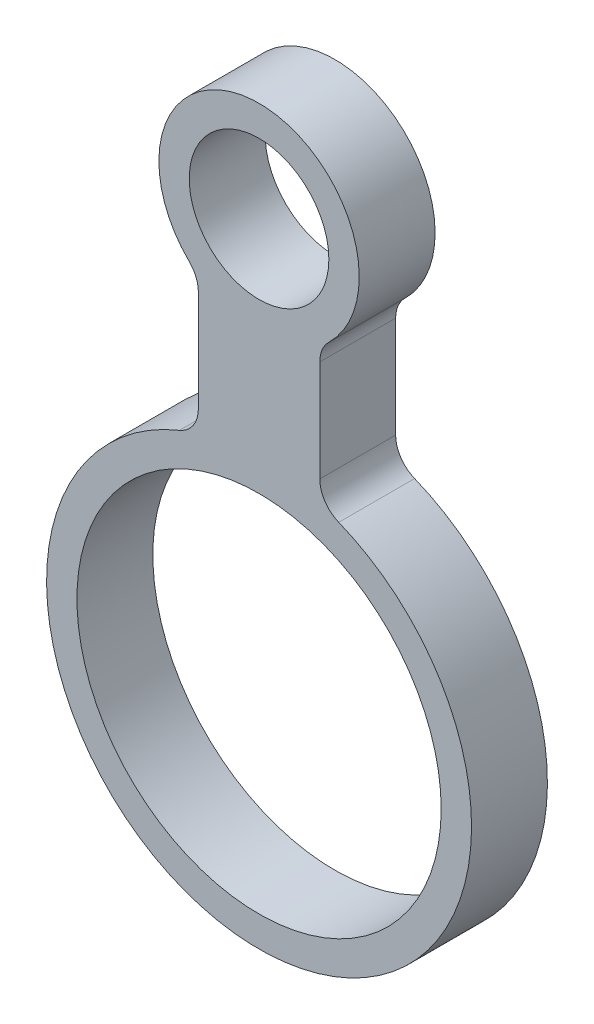
ISO-10303-21;
HEADER;
FILE_DESCRIPTION(('STEP AP214'),'2;1');
FILE_NAME('part.step','',(''),(''),'','','');
FILE_SCHEMA(('AUTOMOTIVE_DESIGN { 1 0 10303 214 1 1 1 1 }'));
ENDSEC;
DATA;
#1=APPLICATION_CONTEXT('core data for automotive mechanical design processes');
#2=APPLICATION_PROTOCOL_DEFINITION('international standard','automotive_design',2000,#1);
#3=PRODUCT_CONTEXT('',#1,'mechanical');
#4=PRODUCT('Part','Part','',(#3));
#5=PRODUCT_RELATED_PRODUCT_CATEGORY('part','',(#4));
#6=PRODUCT_DEFINITION_FORMATION('','',#4);
#7=PRODUCT_DEFINITION_CONTEXT('part definition',#1,'design');
#8=PRODUCT_DEFINITION('design','',#6,#7);
#9=PRODUCT_DEFINITION_SHAPE('','',#8);
#10=(LENGTH_UNIT() NAMED_UNIT(*) SI_UNIT(.MILLI.,.METRE.));
#11=(NAMED_UNIT(*) PLANE_ANGLE_UNIT() SI_UNIT($,.RADIAN.));
#12=(NAMED_UNIT(*) SI_UNIT($,.STERADIAN.) SOLID_ANGLE_UNIT());
#13=UNCERTAINTY_MEASURE_WITH_UNIT(LENGTH_MEASURE(1.E-05),#10,'distance_accuracy_value','');
#14=(GEOMETRIC_REPRESENTATION_CONTEXT(3) GLOBAL_UNCERTAINTY_ASSIGNED_CONTEXT((#13)) GLOBAL_UNIT_ASSIGNED_CONTEXT((#10,
#11,#12)) REPRESENTATION_CONTEXT('',''));
#15=CARTESIAN_POINT('',(0.,0.,0.));
#16=DIRECTION('',(0.,0.,1.));
#17=DIRECTION('',(1.,0.,0.));
#18=AXIS2_PLACEMENT_3D('',#15,#16,#17);
#19=CARTESIAN_POINT('',(0.,27.6661697643614,5.));
#20=DIRECTION('',(0.,0.,1.));
#21=DIRECTION('',(1.,0.,0.));
#22=AXIS2_PLACEMENT_3D('',#19,#20,#21);
#23=PLANE('',#22);
#24=CARTESIAN_POINT('',(0.,0.,5.));
#25=DIRECTION('',(0.,0.,1.));
#26=DIRECTION('',(1.,0.,0.));
#27=AXIS2_PLACEMENT_3D('',#24,#25,#26);
#28=CIRCLE('',#27,12.);
#29=CARTESIAN_POINT('',(12.,0.,5.));
#30=VERTEX_POINT('',#29);
#31=EDGE_CURVE('E200',#30,#30,#28,.T.);
#32=ORIENTED_EDGE('',*,*,#31,.F.);
#33=EDGE_LOOP('',(#32));
#34=FACE_BOUND('',#33,.T.);
#35=DIRECTION('',(0.,1.,0.));
#36=VECTOR('',#35,1.);
#37=CARTESIAN_POINT('',(4.,22.4164078649987,5.));
#38=LINE('',#37,#36);
#39=CARTESIAN_POINT('',(4.,14.8323969741913,5.));
#40=VERTEX_POINT('',#39);
#41=CARTESIAN_POINT('',(4.,21.5050010440617,5.));
#42=VERTEX_POINT('',#41);
#43=EDGE_CURVE('E152',#40,#42,#38,.T.);
#44=ORIENTED_EDGE('',*,*,#43,.T.);
#45=CARTESIAN_POINT('',(6.,21.5050010440617,5.));
#46=DIRECTION('',(0.,0.,1.));
#47=DIRECTION('',(1.,0.,0.));
#48=AXIS2_PLACEMENT_3D('',#45,#46,#47);
#49=CIRCLE('',#48,2.);
#50=CARTESIAN_POINT('',(4.6046511627907,22.9378309790151,5.));
#51=VERTEX_POINT('',#50);
#52=EDGE_CURVE('E183',#42,#51,#49,.F.);
#53=ORIENTED_EDGE('',*,*,#52,.T.);
#54=CARTESIAN_POINT('',(0.,27.6661697643614,5.));
#55=DIRECTION('',(0.,0.,1.));
#56=DIRECTION('',(1.,0.,0.));
#57=AXIS2_PLACEMENT_3D('',#54,#55,#56);
#58=CIRCLE('',#57,6.6);
#59=CARTESIAN_POINT('',(-4.6046511627907,22.9378309790151,5.));
#60=VERTEX_POINT('',#59);
#61=EDGE_CURVE('E144',#51,#60,#58,.T.);
#62=ORIENTED_EDGE('',*,*,#61,.T.);
#63=CARTESIAN_POINT('',(-6.,21.5050010440617,5.));
#64=DIRECTION('',(0.,0.,1.));
#65=DIRECTION('',(1.,0.,0.));
#66=AXIS2_PLACEMENT_3D('',#63,#64,#65);
#67=CIRCLE('',#66,2.);
#68=CARTESIAN_POINT('',(-4.,21.5050010440617,5.));
#69=VERTEX_POINT('',#68);
#70=EDGE_CURVE('E177',#60,#69,#67,.F.);
#71=ORIENTED_EDGE('',*,*,#70,.T.);
#72=DIRECTION('',(0.,-1.,0.));
#73=VECTOR('',#72,1.);
#74=CARTESIAN_POINT('',(-4.,22.4164078649987,5.));
#75=LINE('',#74,#73);
#76=CARTESIAN_POINT('',(-4.,14.8323969741913,5.));
#77=VERTEX_POINT('',#76);
#78=EDGE_CURVE('E189',#69,#77,#75,.T.);
#79=ORIENTED_EDGE('',*,*,#78,.T.);
#80=CARTESIAN_POINT('',(-6.,14.8323969741913,5.));
#81=DIRECTION('',(0.,0.,1.));
#82=DIRECTION('',(1.,0.,0.));
#83=AXIS2_PLACEMENT_3D('',#80,#81,#82);
#84=CIRCLE('',#83,2.);
#85=CARTESIAN_POINT('',(-5.25,12.9783473524174,5.));
#86=VERTEX_POINT('',#85);
#87=EDGE_CURVE('E120',#77,#86,#84,.F.);
#88=ORIENTED_EDGE('',*,*,#87,.T.);
#89=CARTESIAN_POINT('',(0.,0.,5.));
#90=DIRECTION('',(0.,0.,1.));
#91=DIRECTION('',(1.,0.,0.));
#92=AXIS2_PLACEMENT_3D('',#89,#90,#91);
#93=CIRCLE('',#92,14.);
#94=CARTESIAN_POINT('',(5.25,12.9783473524174,5.));
#95=VERTEX_POINT('',#94);
#96=EDGE_CURVE('E128',#86,#95,#93,.T.);
#97=ORIENTED_EDGE('',*,*,#96,.T.);
#98=CARTESIAN_POINT('',(6.,14.8323969741913,5.));
#99=DIRECTION('',(0.,0.,1.));
#100=DIRECTION('',(1.,0.,0.));
#101=AXIS2_PLACEMENT_3D('',#98,#99,#100);
#102=CIRCLE('',#101,2.);
#103=EDGE_CURVE('E11',#95,#40,#102,.F.);
#104=ORIENTED_EDGE('',*,*,#103,.T.);
#105=EDGE_LOOP('',(#44,#53,#62,#71,#79,#88,#97,#104));
#106=FACE_BOUND('',#105,.T.);
#107=CARTESIAN_POINT('',(0.,27.6661697643614,5.));
#108=DIRECTION('',(0.,0.,1.));
#109=DIRECTION('',(1.,0.,0.));
#110=AXIS2_PLACEMENT_3D('',#107,#108,#109);
#111=CIRCLE('',#110,4.6);
#112=CARTESIAN_POINT('',(4.6,27.6661697643614,5.));
#113=VERTEX_POINT('',#112);
#114=EDGE_CURVE('E186',#113,#113,#111,.T.);
#115=ORIENTED_EDGE('',*,*,#114,.F.);
#116=EDGE_LOOP('',(#115));
#117=FACE_BOUND('',#116,.T.);
#118=ADVANCED_FACE('F43',(#34,#106,#117),#23,.T.);
#119=CARTESIAN_POINT('',(0.,27.6661697643614,0.));
#120=DIRECTION('',(0.,0.,1.));
#121=DIRECTION('',(1.,0.,0.));
#122=AXIS2_PLACEMENT_3D('',#119,#120,#121);
#123=PLANE('',#122);
#124=CARTESIAN_POINT('',(0.,27.6661697643614,0.));
#125=DIRECTION('',(0.,0.,1.));
#126=DIRECTION('',(1.,0.,0.));
#127=AXIS2_PLACEMENT_3D('',#124,#125,#126);
#128=CIRCLE('',#127,6.6);
#129=CARTESIAN_POINT('',(4.6046511627907,22.9378309790151,0.));
#130=VERTEX_POINT('',#129);
#131=CARTESIAN_POINT('',(-4.6046511627907,22.9378309790151,0.));
#132=VERTEX_POINT('',#131);
#133=EDGE_CURVE('E147',#130,#132,#128,.T.);
#134=ORIENTED_EDGE('',*,*,#133,.F.);
#135=CARTESIAN_POINT('',(6.,21.5050010440617,0.));
#136=DIRECTION('',(0.,0.,1.));
#137=DIRECTION('',(1.,0.,0.));
#138=AXIS2_PLACEMENT_3D('',#135,#136,#137);
#139=CIRCLE('',#138,2.);
#140=CARTESIAN_POINT('',(4.,21.5050010440617,0.));
#141=VERTEX_POINT('',#140);
#142=EDGE_CURVE('E180',#130,#141,#139,.T.);
#143=ORIENTED_EDGE('',*,*,#142,.T.);
#144=DIRECTION('',(0.,1.,0.));
#145=VECTOR('',#144,1.);
#146=CARTESIAN_POINT('',(4.,22.4164078649987,0.));
#147=LINE('',#146,#145);
#148=CARTESIAN_POINT('',(4.,14.8323969741913,0.));
#149=VERTEX_POINT('',#148);
#150=EDGE_CURVE('E138',#149,#141,#147,.T.);
#151=ORIENTED_EDGE('',*,*,#150,.F.);
#152=CARTESIAN_POINT('',(6.,14.8323969741913,0.));
#153=DIRECTION('',(0.,0.,1.));
#154=DIRECTION('',(1.,0.,0.));
#155=AXIS2_PLACEMENT_3D('',#152,#153,#154);
#156=CIRCLE('',#155,2.);
#157=CARTESIAN_POINT('',(5.25,12.9783473524174,0.));
#158=VERTEX_POINT('',#157);
#159=EDGE_CURVE('E52',#149,#158,#156,.T.);
#160=ORIENTED_EDGE('',*,*,#159,.T.);
#161=CARTESIAN_POINT('',(0.,0.,0.));
#162=DIRECTION('',(0.,0.,1.));
#163=DIRECTION('',(1.,0.,0.));
#164=AXIS2_PLACEMENT_3D('',#161,#162,#163);
#165=CIRCLE('',#164,14.);
#166=CARTESIAN_POINT('',(-5.25,12.9783473524174,0.));
#167=VERTEX_POINT('',#166);
#168=EDGE_CURVE('E126',#167,#158,#165,.T.);
#169=ORIENTED_EDGE('',*,*,#168,.F.);
#170=CARTESIAN_POINT('',(-6.,14.8323969741913,0.));
#171=DIRECTION('',(0.,0.,1.));
#172=DIRECTION('',(1.,0.,0.));
#173=AXIS2_PLACEMENT_3D('',#170,#171,#172);
#174=CIRCLE('',#173,2.);
#175=CARTESIAN_POINT('',(-4.,14.8323969741913,0.));
#176=VERTEX_POINT('',#175);
#177=EDGE_CURVE('E109',#167,#176,#174,.T.);
#178=ORIENTED_EDGE('',*,*,#177,.T.);
#179=DIRECTION('',(0.,-1.,0.));
#180=VECTOR('',#179,1.);
#181=CARTESIAN_POINT('',(-4.,22.4164078649987,0.));
#182=LINE('',#181,#180);
#183=CARTESIAN_POINT('',(-4.,21.5050010440617,0.));
#184=VERTEX_POINT('',#183);
#185=EDGE_CURVE('E139',#184,#176,#182,.T.);
#186=ORIENTED_EDGE('',*,*,#185,.F.);
#187=CARTESIAN_POINT('',(-6.,21.5050010440617,0.));
#188=DIRECTION('',(0.,0.,1.));
#189=DIRECTION('',(1.,0.,0.));
#190=AXIS2_PLACEMENT_3D('',#187,#188,#189);
#191=CIRCLE('',#190,2.);
#192=EDGE_CURVE('E174',#184,#132,#191,.T.);
#193=ORIENTED_EDGE('',*,*,#192,.T.);
#194=EDGE_LOOP('',(#134,#143,#151,#160,#169,#178,#186,#193));
#195=FACE_BOUND('',#194,.T.);
#196=CARTESIAN_POINT('',(0.,0.,0.));
#197=DIRECTION('',(0.,0.,1.));
#198=DIRECTION('',(1.,0.,0.));
#199=AXIS2_PLACEMENT_3D('',#196,#197,#198);
#200=CIRCLE('',#199,12.);
#201=CARTESIAN_POINT('',(12.,0.,0.));
#202=VERTEX_POINT('',#201);
#203=EDGE_CURVE('E197',#202,#202,#200,.T.);
#204=ORIENTED_EDGE('',*,*,#203,.T.);
#205=EDGE_LOOP('',(#204));
#206=FACE_BOUND('',#205,.T.);
#207=CARTESIAN_POINT('',(0.,27.6661697643614,0.));
#208=DIRECTION('',(0.,0.,1.));
#209=DIRECTION('',(1.,0.,0.));
#210=AXIS2_PLACEMENT_3D('',#207,#208,#209);
#211=CIRCLE('',#210,4.6);
#212=CARTESIAN_POINT('',(4.6,27.6661697643614,0.));
#213=VERTEX_POINT('',#212);
#214=EDGE_CURVE('E193',#213,#213,#211,.T.);
#215=ORIENTED_EDGE('',*,*,#214,.T.);
#216=EDGE_LOOP('',(#215));
#217=FACE_BOUND('',#216,.T.);
#218=ADVANCED_FACE('F134',(#195,#206,#217),#123,.F.);
#219=CARTESIAN_POINT('',(0.,27.6661697643614,5.));
#220=DIRECTION('',(0.,0.,-1.));
#221=DIRECTION('',(-1.,0.,0.));
#222=AXIS2_PLACEMENT_3D('',#219,#220,#221);
#223=CYLINDRICAL_SURFACE('',#222,6.6);
#224=ORIENTED_EDGE('',*,*,#133,.T.);
#225=DIRECTION('',(0.,0.,-1.));
#226=VECTOR('',#225,1.);
#227=CARTESIAN_POINT('',(-4.6046511627907,22.9378309790151,5.));
#228=LINE('',#227,#226);
#229=EDGE_CURVE('E163',#132,#60,#228,.F.);
#230=ORIENTED_EDGE('',*,*,#229,.T.);
#231=ORIENTED_EDGE('',*,*,#61,.F.);
#232=DIRECTION('',(0.,0.,-1.));
#233=VECTOR('',#232,1.);
#234=CARTESIAN_POINT('',(4.6046511627907,22.9378309790151,5.));
#235=LINE('',#234,#233);
#236=EDGE_CURVE('E159',#51,#130,#235,.T.);
#237=ORIENTED_EDGE('',*,*,#236,.T.);
#238=EDGE_LOOP('',(#224,#230,#231,#237));
#239=FACE_BOUND('',#238,.T.);
#240=ADVANCED_FACE('F229',(#239),#223,.T.);
#241=CARTESIAN_POINT('',(-4.,22.4164078649987,5.));
#242=DIRECTION('',(1.,0.,0.));
#243=DIRECTION('',(0.,1.,0.));
#244=AXIS2_PLACEMENT_3D('',#241,#242,#243);
#245=PLANE('',#244);
#246=ORIENTED_EDGE('',*,*,#185,.T.);
#247=DIRECTION('',(0.,0.,1.));
#248=VECTOR('',#247,1.);
#249=CARTESIAN_POINT('',(-4.,14.8323969741913,5.));
#250=LINE('',#249,#248);
#251=EDGE_CURVE('E114',#176,#77,#250,.T.);
#252=ORIENTED_EDGE('',*,*,#251,.T.);
#253=ORIENTED_EDGE('',*,*,#78,.F.);
#254=DIRECTION('',(0.,0.,1.));
#255=VECTOR('',#254,1.);
#256=CARTESIAN_POINT('',(-4.,21.5050010440617,0.));
#257=LINE('',#256,#255);
#258=EDGE_CURVE('E130',#69,#184,#257,.F.);
#259=ORIENTED_EDGE('',*,*,#258,.T.);
#260=EDGE_LOOP('',(#246,#252,#253,#259));
#261=FACE_BOUND('',#260,.T.);
#262=ADVANCED_FACE('F240',(#261),#245,.F.);
#263=CARTESIAN_POINT('',(0.,0.,5.));
#264=DIRECTION('',(0.,0.,-1.));
#265=DIRECTION('',(-1.,0.,0.));
#266=AXIS2_PLACEMENT_3D('',#263,#264,#265);
#267=CYLINDRICAL_SURFACE('',#266,14.);
#268=ORIENTED_EDGE('',*,*,#96,.F.);
#269=DIRECTION('',(0.,0.,-1.));
#270=VECTOR('',#269,1.);
#271=CARTESIAN_POINT('',(-5.25,12.9783473524174,5.));
#272=LINE('',#271,#270);
#273=EDGE_CURVE('E113',#86,#167,#272,.T.);
#274=ORIENTED_EDGE('',*,*,#273,.T.);
#275=ORIENTED_EDGE('',*,*,#168,.T.);
#276=DIRECTION('',(0.,0.,-1.));
#277=VECTOR('',#276,1.);
#278=CARTESIAN_POINT('',(5.25,12.9783473524174,5.));
#279=LINE('',#278,#277);
#280=EDGE_CURVE('E131',#158,#95,#279,.F.);
#281=ORIENTED_EDGE('',*,*,#280,.T.);
#282=EDGE_LOOP('',(#268,#274,#275,#281));
#283=FACE_BOUND('',#282,.T.);
#284=ADVANCED_FACE('F125',(#283),#267,.T.);
#285=CARTESIAN_POINT('',(4.,22.4164078649987,5.));
#286=DIRECTION('',(-1.,0.,0.));
#287=DIRECTION('',(0.,-1.,0.));
#288=AXIS2_PLACEMENT_3D('',#285,#286,#287);
#289=PLANE('',#288);
#290=ORIENTED_EDGE('',*,*,#150,.T.);
#291=DIRECTION('',(0.,0.,1.));
#292=VECTOR('',#291,1.);
#293=CARTESIAN_POINT('',(4.,21.5050010440617,5.));
#294=LINE('',#293,#292);
#295=EDGE_CURVE('E59',#141,#42,#294,.T.);
#296=ORIENTED_EDGE('',*,*,#295,.T.);
#297=ORIENTED_EDGE('',*,*,#43,.F.);
#298=DIRECTION('',(0.,0.,1.));
#299=VECTOR('',#298,1.);
#300=CARTESIAN_POINT('',(4.,14.8323969741913,0.));
#301=LINE('',#300,#299);
#302=EDGE_CURVE('E166',#40,#149,#301,.F.);
#303=ORIENTED_EDGE('',*,*,#302,.T.);
#304=EDGE_LOOP('',(#290,#296,#297,#303));
#305=FACE_BOUND('',#304,.T.);
#306=ADVANCED_FACE('F235',(#305),#289,.F.);
#307=CARTESIAN_POINT('',(0.,0.,5.));
#308=DIRECTION('',(0.,0.,-1.));
#309=DIRECTION('',(-1.,0.,0.));
#310=AXIS2_PLACEMENT_3D('',#307,#308,#309);
#311=CYLINDRICAL_SURFACE('',#310,12.);
#312=ORIENTED_EDGE('',*,*,#31,.T.);
#313=EDGE_LOOP('',(#312));
#314=FACE_BOUND('',#313,.T.);
#315=ORIENTED_EDGE('',*,*,#203,.F.);
#316=EDGE_LOOP('',(#315));
#317=FACE_BOUND('',#316,.T.);
#318=ADVANCED_FACE('F232',(#314,#317),#311,.F.);
#319=CARTESIAN_POINT('',(0.,27.6661697643614,5.));
#320=DIRECTION('',(0.,0.,-1.));
#321=DIRECTION('',(-1.,0.,0.));
#322=AXIS2_PLACEMENT_3D('',#319,#320,#321);
#323=CYLINDRICAL_SURFACE('',#322,4.6);
#324=ORIENTED_EDGE('',*,*,#114,.T.);
#325=EDGE_LOOP('',(#324));
#326=FACE_BOUND('',#325,.T.);
#327=ORIENTED_EDGE('',*,*,#214,.F.);
#328=EDGE_LOOP('',(#327));
#329=FACE_BOUND('',#328,.T.);
#330=ADVANCED_FACE('F221',(#326,#329),#323,.F.);
#331=CARTESIAN_POINT('',(-6.,14.8323969741913,5.));
#332=DIRECTION('',(0.,0.,-1.));
#333=DIRECTION('',(-1.,0.,0.));
#334=AXIS2_PLACEMENT_3D('',#331,#332,#333);
#335=CYLINDRICAL_SURFACE('',#334,2.);
#336=ORIENTED_EDGE('',*,*,#87,.F.);
#337=ORIENTED_EDGE('',*,*,#251,.F.);
#338=ORIENTED_EDGE('',*,*,#177,.F.);
#339=ORIENTED_EDGE('',*,*,#273,.F.);
#340=EDGE_LOOP('',(#336,#337,#338,#339));
#341=FACE_BOUND('',#340,.T.);
#342=ADVANCED_FACE('F112',(#341),#335,.F.);
#343=CARTESIAN_POINT('',(-6.,21.5050010440617,5.));
#344=DIRECTION('',(0.,0.,-1.));
#345=DIRECTION('',(-1.,0.,0.));
#346=AXIS2_PLACEMENT_3D('',#343,#344,#345);
#347=CYLINDRICAL_SURFACE('',#346,2.);
#348=ORIENTED_EDGE('',*,*,#70,.F.);
#349=ORIENTED_EDGE('',*,*,#229,.F.);
#350=ORIENTED_EDGE('',*,*,#192,.F.);
#351=ORIENTED_EDGE('',*,*,#258,.F.);
#352=EDGE_LOOP('',(#348,#349,#350,#351));
#353=FACE_BOUND('',#352,.T.);
#354=ADVANCED_FACE('F248',(#353),#347,.F.);
#355=CARTESIAN_POINT('',(6.,21.5050010440617,5.));
#356=DIRECTION('',(0.,0.,-1.));
#357=DIRECTION('',(-1.,0.,0.));
#358=AXIS2_PLACEMENT_3D('',#355,#356,#357);
#359=CYLINDRICAL_SURFACE('',#358,2.);
#360=ORIENTED_EDGE('',*,*,#52,.F.);
#361=ORIENTED_EDGE('',*,*,#295,.F.);
#362=ORIENTED_EDGE('',*,*,#142,.F.);
#363=ORIENTED_EDGE('',*,*,#236,.F.);
#364=EDGE_LOOP('',(#360,#361,#362,#363));
#365=FACE_BOUND('',#364,.T.);
#366=ADVANCED_FACE('F250',(#365),#359,.F.);
#367=CARTESIAN_POINT('',(6.,14.8323969741913,5.));
#368=DIRECTION('',(0.,0.,-1.));
#369=DIRECTION('',(-1.,0.,0.));
#370=AXIS2_PLACEMENT_3D('',#367,#368,#369);
#371=CYLINDRICAL_SURFACE('',#370,2.);
#372=ORIENTED_EDGE('',*,*,#103,.F.);
#373=ORIENTED_EDGE('',*,*,#280,.F.);
#374=ORIENTED_EDGE('',*,*,#159,.F.);
#375=ORIENTED_EDGE('',*,*,#302,.F.);
#376=EDGE_LOOP('',(#372,#373,#374,#375));
#377=FACE_BOUND('',#376,.T.);
#378=ADVANCED_FACE('F45',(#377),#371,.F.);
#379=CLOSED_SHELL('',(#118,#218,#240,#262,#284,#306,#318,#330,#342,#354,#366,#378));
#380=MANIFOLD_SOLID_BREP('B2',#379);
#381=ADVANCED_BREP_SHAPE_REPRESENTATION('',(#18,#380),#14);
#382=SHAPE_DEFINITION_REPRESENTATION(#9,#381);
ENDSEC;
END-ISO-10303-21;
